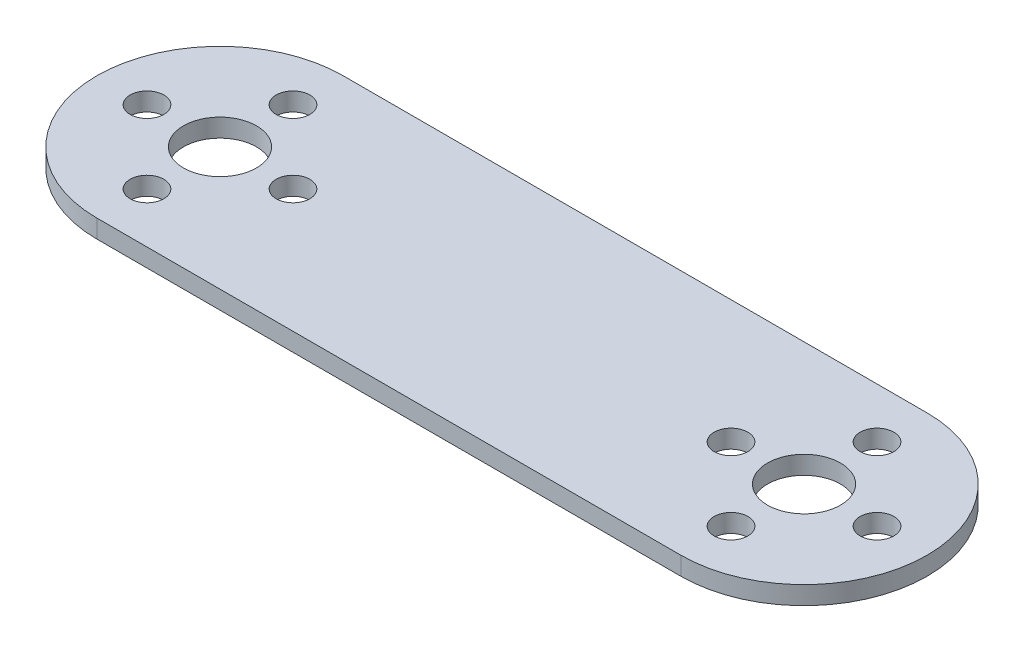
ISO-10303-21;
HEADER;
FILE_DESCRIPTION(('STEP AP214'),'2;1');
FILE_NAME('part.step','',(''),(''),'','','');
FILE_SCHEMA(('AUTOMOTIVE_DESIGN { 1 0 10303 214 1 1 1 1 }'));
ENDSEC;
DATA;
#1=APPLICATION_CONTEXT('core data for automotive mechanical design processes');
#2=APPLICATION_PROTOCOL_DEFINITION('international standard','automotive_design',2000,#1);
#3=PRODUCT_CONTEXT('',#1,'mechanical');
#4=PRODUCT('Part','Part','',(#3));
#5=PRODUCT_RELATED_PRODUCT_CATEGORY('part','',(#4));
#6=PRODUCT_DEFINITION_FORMATION('','',#4);
#7=PRODUCT_DEFINITION_CONTEXT('part definition',#1,'design');
#8=PRODUCT_DEFINITION('design','',#6,#7);
#9=PRODUCT_DEFINITION_SHAPE('','',#8);
#10=(LENGTH_UNIT() NAMED_UNIT(*) SI_UNIT(.MILLI.,.METRE.));
#11=(NAMED_UNIT(*) PLANE_ANGLE_UNIT() SI_UNIT($,.RADIAN.));
#12=(NAMED_UNIT(*) SI_UNIT($,.STERADIAN.) SOLID_ANGLE_UNIT());
#13=UNCERTAINTY_MEASURE_WITH_UNIT(LENGTH_MEASURE(1.E-05),#10,'distance_accuracy_value','');
#14=(GEOMETRIC_REPRESENTATION_CONTEXT(3) GLOBAL_UNCERTAINTY_ASSIGNED_CONTEXT((#13)) GLOBAL_UNIT_ASSIGNED_CONTEXT((#10,
#11,#12)) REPRESENTATION_CONTEXT('',''));
#15=CARTESIAN_POINT('',(0.,0.,0.));
#16=DIRECTION('',(0.,0.,1.));
#17=DIRECTION('',(1.,0.,0.));
#18=AXIS2_PLACEMENT_3D('',#15,#16,#17);
#19=CARTESIAN_POINT('',(-32.,0.,0.));
#20=DIRECTION('',(0.,-1.,0.));
#21=DIRECTION('',(0.,0.,-1.));
#22=AXIS2_PLACEMENT_3D('',#19,#20,#21);
#23=CYLINDRICAL_SURFACE('',#22,13.5);
#24=DIRECTION('',(0.,-1.,0.));
#25=VECTOR('',#24,1.);
#26=CARTESIAN_POINT('',(-32.,2.,-13.5));
#27=LINE('',#26,#25);
#28=CARTESIAN_POINT('',(-32.,0.,-13.5));
#29=VERTEX_POINT('',#28);
#30=CARTESIAN_POINT('',(-32.,2.,-13.5));
#31=VERTEX_POINT('',#30);
#32=EDGE_CURVE('E105',#29,#31,#27,.F.);
#33=ORIENTED_EDGE('',*,*,#32,.F.);
#34=CARTESIAN_POINT('',(-32.,0.,0.));
#35=DIRECTION('',(0.,-1.,0.));
#36=DIRECTION('',(0.,0.,-1.));
#37=AXIS2_PLACEMENT_3D('',#34,#35,#36);
#38=CIRCLE('',#37,13.5);
#39=CARTESIAN_POINT('',(-32.,0.,13.5));
#40=VERTEX_POINT('',#39);
#41=EDGE_CURVE('E44',#40,#29,#38,.T.);
#42=ORIENTED_EDGE('',*,*,#41,.F.);
#43=DIRECTION('',(0.,-1.,0.));
#44=VECTOR('',#43,1.);
#45=CARTESIAN_POINT('',(-32.,2.,13.5));
#46=LINE('',#45,#44);
#47=CARTESIAN_POINT('',(-32.,2.,13.5));
#48=VERTEX_POINT('',#47);
#49=EDGE_CURVE('E80',#48,#40,#46,.T.);
#50=ORIENTED_EDGE('',*,*,#49,.F.);
#51=CARTESIAN_POINT('',(-32.,2.,0.));
#52=DIRECTION('',(0.,-1.,0.));
#53=DIRECTION('',(0.,0.,-1.));
#54=AXIS2_PLACEMENT_3D('',#51,#52,#53);
#55=CIRCLE('',#54,13.5);
#56=EDGE_CURVE('E11',#31,#48,#55,.F.);
#57=ORIENTED_EDGE('',*,*,#56,.F.);
#58=EDGE_LOOP('',(#33,#42,#50,#57));
#59=FACE_BOUND('',#58,.T.);
#60=ADVANCED_FACE('F37',(#59),#23,.T.);
#61=CARTESIAN_POINT('',(32.,0.,0.));
#62=DIRECTION('',(0.,-1.,0.));
#63=DIRECTION('',(0.,0.,-1.));
#64=AXIS2_PLACEMENT_3D('',#61,#62,#63);
#65=CYLINDRICAL_SURFACE('',#64,13.5);
#66=DIRECTION('',(0.,-1.,0.));
#67=VECTOR('',#66,1.);
#68=CARTESIAN_POINT('',(32.,2.,13.5));
#69=LINE('',#68,#67);
#70=CARTESIAN_POINT('',(32.,0.,13.5));
#71=VERTEX_POINT('',#70);
#72=CARTESIAN_POINT('',(32.,2.,13.5));
#73=VERTEX_POINT('',#72);
#74=EDGE_CURVE('E79',#71,#73,#69,.F.);
#75=ORIENTED_EDGE('',*,*,#74,.F.);
#76=CARTESIAN_POINT('',(32.,0.,0.));
#77=DIRECTION('',(0.,-1.,0.));
#78=DIRECTION('',(0.,0.,-1.));
#79=AXIS2_PLACEMENT_3D('',#76,#77,#78);
#80=CIRCLE('',#79,13.5);
#81=CARTESIAN_POINT('',(32.,0.,-13.5));
#82=VERTEX_POINT('',#81);
#83=EDGE_CURVE('E86',#82,#71,#80,.T.);
#84=ORIENTED_EDGE('',*,*,#83,.F.);
#85=DIRECTION('',(0.,-1.,0.));
#86=VECTOR('',#85,1.);
#87=CARTESIAN_POINT('',(32.,2.,-13.5));
#88=LINE('',#87,#86);
#89=CARTESIAN_POINT('',(32.,2.,-13.5));
#90=VERTEX_POINT('',#89);
#91=EDGE_CURVE('E93',#90,#82,#88,.T.);
#92=ORIENTED_EDGE('',*,*,#91,.F.);
#93=CARTESIAN_POINT('',(32.,2.,0.));
#94=DIRECTION('',(0.,-1.,0.));
#95=DIRECTION('',(0.,0.,-1.));
#96=AXIS2_PLACEMENT_3D('',#93,#94,#95);
#97=CIRCLE('',#96,13.5);
#98=EDGE_CURVE('E92',#73,#90,#97,.F.);
#99=ORIENTED_EDGE('',*,*,#98,.F.);
#100=EDGE_LOOP('',(#75,#84,#92,#99));
#101=FACE_BOUND('',#100,.T.);
#102=ADVANCED_FACE('F96',(#101),#65,.T.);
#103=CARTESIAN_POINT('',(-45.5,2.,13.5));
#104=DIRECTION('',(0.,0.,-1.));
#105=DIRECTION('',(-1.,0.,0.));
#106=AXIS2_PLACEMENT_3D('',#103,#104,#105);
#107=PLANE('',#106);
#108=DIRECTION('',(1.,0.,0.));
#109=VECTOR('',#108,1.);
#110=CARTESIAN_POINT('',(-45.5,2.,13.5));
#111=LINE('',#110,#109);
#112=EDGE_CURVE('E100',#48,#73,#111,.T.);
#113=ORIENTED_EDGE('',*,*,#112,.F.);
#114=ORIENTED_EDGE('',*,*,#49,.T.);
#115=DIRECTION('',(1.,0.,0.));
#116=VECTOR('',#115,1.);
#117=CARTESIAN_POINT('',(-45.5,0.,13.5));
#118=LINE('',#117,#116);
#119=EDGE_CURVE('E74',#40,#71,#118,.T.);
#120=ORIENTED_EDGE('',*,*,#119,.T.);
#121=ORIENTED_EDGE('',*,*,#74,.T.);
#122=EDGE_LOOP('',(#113,#114,#120,#121));
#123=FACE_BOUND('',#122,.T.);
#124=ADVANCED_FACE('F77',(#123),#107,.F.);
#125=CARTESIAN_POINT('',(-45.5,2.,-13.5));
#126=DIRECTION('',(0.,0.,1.));
#127=DIRECTION('',(1.,0.,0.));
#128=AXIS2_PLACEMENT_3D('',#125,#126,#127);
#129=PLANE('',#128);
#130=DIRECTION('',(-1.,0.,0.));
#131=VECTOR('',#130,1.);
#132=CARTESIAN_POINT('',(-45.5,0.,-13.5));
#133=LINE('',#132,#131);
#134=EDGE_CURVE('E82',#82,#29,#133,.T.);
#135=ORIENTED_EDGE('',*,*,#134,.T.);
#136=ORIENTED_EDGE('',*,*,#32,.T.);
#137=DIRECTION('',(-1.,0.,0.));
#138=VECTOR('',#137,1.);
#139=CARTESIAN_POINT('',(-45.5,2.,-13.5));
#140=LINE('',#139,#138);
#141=EDGE_CURVE('E97',#90,#31,#140,.T.);
#142=ORIENTED_EDGE('',*,*,#141,.F.);
#143=ORIENTED_EDGE('',*,*,#91,.T.);
#144=EDGE_LOOP('',(#135,#136,#142,#143));
#145=FACE_BOUND('',#144,.T.);
#146=ADVANCED_FACE('F110',(#145),#129,.F.);
#147=CARTESIAN_POINT('',(-45.5,2.,-13.5));
#148=DIRECTION('',(0.,-1.,0.));
#149=DIRECTION('',(0.,0.,-1.));
#150=AXIS2_PLACEMENT_3D('',#147,#148,#149);
#151=PLANE('',#150);
#152=CARTESIAN_POINT('',(32.,2.,-8.));
#153=DIRECTION('',(0.,1.,0.));
#154=DIRECTION('',(0.,0.,1.));
#155=AXIS2_PLACEMENT_3D('',#152,#153,#154);
#156=CIRCLE('',#155,1.85);
#157=CARTESIAN_POINT('',(32.,2.,-6.15));
#158=VERTEX_POINT('',#157);
#159=EDGE_CURVE('E167',#158,#158,#156,.T.);
#160=ORIENTED_EDGE('',*,*,#159,.F.);
#161=EDGE_LOOP('',(#160));
#162=FACE_BOUND('',#161,.T.);
#163=CARTESIAN_POINT('',(32.,2.,8.));
#164=DIRECTION('',(0.,1.,0.));
#165=DIRECTION('',(0.,0.,1.));
#166=AXIS2_PLACEMENT_3D('',#163,#164,#165);
#167=CIRCLE('',#166,1.85);
#168=CARTESIAN_POINT('',(32.,2.,9.85));
#169=VERTEX_POINT('',#168);
#170=EDGE_CURVE('E161',#169,#169,#167,.T.);
#171=ORIENTED_EDGE('',*,*,#170,.F.);
#172=EDGE_LOOP('',(#171));
#173=FACE_BOUND('',#172,.T.);
#174=CARTESIAN_POINT('',(24.,2.,0.));
#175=DIRECTION('',(0.,1.,0.));
#176=DIRECTION('',(0.,0.,1.));
#177=AXIS2_PLACEMENT_3D('',#174,#175,#176);
#178=CIRCLE('',#177,1.85);
#179=CARTESIAN_POINT('',(24.,2.,1.85));
#180=VERTEX_POINT('',#179);
#181=EDGE_CURVE('E155',#180,#180,#178,.T.);
#182=ORIENTED_EDGE('',*,*,#181,.F.);
#183=EDGE_LOOP('',(#182));
#184=FACE_BOUND('',#183,.T.);
#185=CARTESIAN_POINT('',(40.,2.,0.));
#186=DIRECTION('',(0.,1.,0.));
#187=DIRECTION('',(0.,0.,1.));
#188=AXIS2_PLACEMENT_3D('',#185,#186,#187);
#189=CIRCLE('',#188,1.85);
#190=CARTESIAN_POINT('',(40.,2.,1.85));
#191=VERTEX_POINT('',#190);
#192=EDGE_CURVE('E149',#191,#191,#189,.T.);
#193=ORIENTED_EDGE('',*,*,#192,.F.);
#194=EDGE_LOOP('',(#193));
#195=FACE_BOUND('',#194,.T.);
#196=CARTESIAN_POINT('',(32.,2.,0.));
#197=DIRECTION('',(0.,1.,0.));
#198=DIRECTION('',(0.,0.,1.));
#199=AXIS2_PLACEMENT_3D('',#196,#197,#198);
#200=CIRCLE('',#199,4.);
#201=CARTESIAN_POINT('',(32.,2.,4.00000000000001));
#202=VERTEX_POINT('',#201);
#203=EDGE_CURVE('E143',#202,#202,#200,.T.);
#204=ORIENTED_EDGE('',*,*,#203,.F.);
#205=EDGE_LOOP('',(#204));
#206=FACE_BOUND('',#205,.T.);
#207=CARTESIAN_POINT('',(-32.,2.,-8.));
#208=DIRECTION('',(0.,1.,0.));
#209=DIRECTION('',(0.,0.,1.));
#210=AXIS2_PLACEMENT_3D('',#207,#208,#209);
#211=CIRCLE('',#210,1.85);
#212=CARTESIAN_POINT('',(-32.,2.,-6.15));
#213=VERTEX_POINT('',#212);
#214=EDGE_CURVE('E137',#213,#213,#211,.T.);
#215=ORIENTED_EDGE('',*,*,#214,.F.);
#216=EDGE_LOOP('',(#215));
#217=FACE_BOUND('',#216,.T.);
#218=CARTESIAN_POINT('',(-32.,2.,8.));
#219=DIRECTION('',(0.,1.,0.));
#220=DIRECTION('',(0.,0.,1.));
#221=AXIS2_PLACEMENT_3D('',#218,#219,#220);
#222=CIRCLE('',#221,1.85);
#223=CARTESIAN_POINT('',(-32.,2.,9.85));
#224=VERTEX_POINT('',#223);
#225=EDGE_CURVE('E131',#224,#224,#222,.T.);
#226=ORIENTED_EDGE('',*,*,#225,.F.);
#227=EDGE_LOOP('',(#226));
#228=FACE_BOUND('',#227,.T.);
#229=CARTESIAN_POINT('',(-40.,2.,0.));
#230=DIRECTION('',(0.,1.,0.));
#231=DIRECTION('',(0.,0.,1.));
#232=AXIS2_PLACEMENT_3D('',#229,#230,#231);
#233=CIRCLE('',#232,1.85);
#234=CARTESIAN_POINT('',(-40.,2.,1.85));
#235=VERTEX_POINT('',#234);
#236=EDGE_CURVE('E125',#235,#235,#233,.T.);
#237=ORIENTED_EDGE('',*,*,#236,.F.);
#238=EDGE_LOOP('',(#237));
#239=FACE_BOUND('',#238,.T.);
#240=CARTESIAN_POINT('',(-24.,2.,0.));
#241=DIRECTION('',(0.,1.,0.));
#242=DIRECTION('',(0.,0.,1.));
#243=AXIS2_PLACEMENT_3D('',#240,#241,#242);
#244=CIRCLE('',#243,1.85);
#245=CARTESIAN_POINT('',(-24.,2.,1.85));
#246=VERTEX_POINT('',#245);
#247=EDGE_CURVE('E119',#246,#246,#244,.T.);
#248=ORIENTED_EDGE('',*,*,#247,.F.);
#249=EDGE_LOOP('',(#248));
#250=FACE_BOUND('',#249,.T.);
#251=CARTESIAN_POINT('',(-32.,2.,0.));
#252=DIRECTION('',(0.,1.,0.));
#253=DIRECTION('',(0.,0.,1.));
#254=AXIS2_PLACEMENT_3D('',#251,#252,#253);
#255=CIRCLE('',#254,4.);
#256=CARTESIAN_POINT('',(-32.,2.,4.00000000000001));
#257=VERTEX_POINT('',#256);
#258=EDGE_CURVE('E113',#257,#257,#255,.T.);
#259=ORIENTED_EDGE('',*,*,#258,.F.);
#260=EDGE_LOOP('',(#259));
#261=FACE_BOUND('',#260,.T.);
#262=ORIENTED_EDGE('',*,*,#141,.T.);
#263=ORIENTED_EDGE('',*,*,#56,.T.);
#264=ORIENTED_EDGE('',*,*,#112,.T.);
#265=ORIENTED_EDGE('',*,*,#98,.T.);
#266=EDGE_LOOP('',(#262,#263,#264,#265));
#267=FACE_BOUND('',#266,.T.);
#268=ADVANCED_FACE('F182',(#162,#173,#184,#195,#206,#217,#228,#239,#250,#261,#267),#151,.F.);
#269=CARTESIAN_POINT('',(-45.5,0.,-13.5));
#270=DIRECTION('',(0.,-1.,0.));
#271=DIRECTION('',(0.,0.,-1.));
#272=AXIS2_PLACEMENT_3D('',#269,#270,#271);
#273=PLANE('',#272);
#274=CARTESIAN_POINT('',(32.,0.,-8.));
#275=DIRECTION('',(0.,1.,0.));
#276=DIRECTION('',(0.,0.,1.));
#277=AXIS2_PLACEMENT_3D('',#274,#275,#276);
#278=CIRCLE('',#277,1.85);
#279=CARTESIAN_POINT('',(32.,0.,-6.15));
#280=VERTEX_POINT('',#279);
#281=EDGE_CURVE('E164',#280,#280,#278,.T.);
#282=ORIENTED_EDGE('',*,*,#281,.T.);
#283=EDGE_LOOP('',(#282));
#284=FACE_BOUND('',#283,.T.);
#285=CARTESIAN_POINT('',(32.,0.,8.));
#286=DIRECTION('',(0.,1.,0.));
#287=DIRECTION('',(0.,0.,1.));
#288=AXIS2_PLACEMENT_3D('',#285,#286,#287);
#289=CIRCLE('',#288,1.85);
#290=CARTESIAN_POINT('',(32.,0.,9.85));
#291=VERTEX_POINT('',#290);
#292=EDGE_CURVE('E158',#291,#291,#289,.T.);
#293=ORIENTED_EDGE('',*,*,#292,.T.);
#294=EDGE_LOOP('',(#293));
#295=FACE_BOUND('',#294,.T.);
#296=CARTESIAN_POINT('',(24.,0.,0.));
#297=DIRECTION('',(0.,1.,0.));
#298=DIRECTION('',(0.,0.,1.));
#299=AXIS2_PLACEMENT_3D('',#296,#297,#298);
#300=CIRCLE('',#299,1.85);
#301=CARTESIAN_POINT('',(24.,0.,1.85));
#302=VERTEX_POINT('',#301);
#303=EDGE_CURVE('E152',#302,#302,#300,.T.);
#304=ORIENTED_EDGE('',*,*,#303,.T.);
#305=EDGE_LOOP('',(#304));
#306=FACE_BOUND('',#305,.T.);
#307=CARTESIAN_POINT('',(40.,0.,0.));
#308=DIRECTION('',(0.,1.,0.));
#309=DIRECTION('',(0.,0.,1.));
#310=AXIS2_PLACEMENT_3D('',#307,#308,#309);
#311=CIRCLE('',#310,1.85);
#312=CARTESIAN_POINT('',(40.,0.,1.85));
#313=VERTEX_POINT('',#312);
#314=EDGE_CURVE('E146',#313,#313,#311,.T.);
#315=ORIENTED_EDGE('',*,*,#314,.T.);
#316=EDGE_LOOP('',(#315));
#317=FACE_BOUND('',#316,.T.);
#318=CARTESIAN_POINT('',(32.,0.,0.));
#319=DIRECTION('',(0.,1.,0.));
#320=DIRECTION('',(0.,0.,1.));
#321=AXIS2_PLACEMENT_3D('',#318,#319,#320);
#322=CIRCLE('',#321,4.);
#323=CARTESIAN_POINT('',(32.,0.,4.00000000000001));
#324=VERTEX_POINT('',#323);
#325=EDGE_CURVE('E140',#324,#324,#322,.T.);
#326=ORIENTED_EDGE('',*,*,#325,.T.);
#327=EDGE_LOOP('',(#326));
#328=FACE_BOUND('',#327,.T.);
#329=CARTESIAN_POINT('',(-32.,0.,-8.));
#330=DIRECTION('',(0.,1.,0.));
#331=DIRECTION('',(0.,0.,1.));
#332=AXIS2_PLACEMENT_3D('',#329,#330,#331);
#333=CIRCLE('',#332,1.85);
#334=CARTESIAN_POINT('',(-32.,0.,-6.15));
#335=VERTEX_POINT('',#334);
#336=EDGE_CURVE('E134',#335,#335,#333,.T.);
#337=ORIENTED_EDGE('',*,*,#336,.T.);
#338=EDGE_LOOP('',(#337));
#339=FACE_BOUND('',#338,.T.);
#340=CARTESIAN_POINT('',(-32.,0.,8.));
#341=DIRECTION('',(0.,1.,0.));
#342=DIRECTION('',(0.,0.,1.));
#343=AXIS2_PLACEMENT_3D('',#340,#341,#342);
#344=CIRCLE('',#343,1.85);
#345=CARTESIAN_POINT('',(-32.,0.,9.85));
#346=VERTEX_POINT('',#345);
#347=EDGE_CURVE('E128',#346,#346,#344,.T.);
#348=ORIENTED_EDGE('',*,*,#347,.T.);
#349=EDGE_LOOP('',(#348));
#350=FACE_BOUND('',#349,.T.);
#351=CARTESIAN_POINT('',(-40.,0.,0.));
#352=DIRECTION('',(0.,1.,0.));
#353=DIRECTION('',(0.,0.,1.));
#354=AXIS2_PLACEMENT_3D('',#351,#352,#353);
#355=CIRCLE('',#354,1.85);
#356=CARTESIAN_POINT('',(-40.,0.,1.85));
#357=VERTEX_POINT('',#356);
#358=EDGE_CURVE('E122',#357,#357,#355,.T.);
#359=ORIENTED_EDGE('',*,*,#358,.T.);
#360=EDGE_LOOP('',(#359));
#361=FACE_BOUND('',#360,.T.);
#362=CARTESIAN_POINT('',(-24.,0.,0.));
#363=DIRECTION('',(0.,1.,0.));
#364=DIRECTION('',(0.,0.,1.));
#365=AXIS2_PLACEMENT_3D('',#362,#363,#364);
#366=CIRCLE('',#365,1.85);
#367=CARTESIAN_POINT('',(-24.,0.,1.85));
#368=VERTEX_POINT('',#367);
#369=EDGE_CURVE('E116',#368,#368,#366,.T.);
#370=ORIENTED_EDGE('',*,*,#369,.T.);
#371=EDGE_LOOP('',(#370));
#372=FACE_BOUND('',#371,.T.);
#373=CARTESIAN_POINT('',(-32.,0.,0.));
#374=DIRECTION('',(0.,1.,0.));
#375=DIRECTION('',(0.,0.,1.));
#376=AXIS2_PLACEMENT_3D('',#373,#374,#375);
#377=CIRCLE('',#376,4.);
#378=CARTESIAN_POINT('',(-32.,0.,4.00000000000001));
#379=VERTEX_POINT('',#378);
#380=EDGE_CURVE('E83',#379,#379,#377,.T.);
#381=ORIENTED_EDGE('',*,*,#380,.T.);
#382=EDGE_LOOP('',(#381));
#383=FACE_BOUND('',#382,.T.);
#384=ORIENTED_EDGE('',*,*,#119,.F.);
#385=ORIENTED_EDGE('',*,*,#41,.T.);
#386=ORIENTED_EDGE('',*,*,#134,.F.);
#387=ORIENTED_EDGE('',*,*,#83,.T.);
#388=EDGE_LOOP('',(#384,#385,#386,#387));
#389=FACE_BOUND('',#388,.T.);
#390=ADVANCED_FACE('F87',(#284,#295,#306,#317,#328,#339,#350,#361,#372,#383,#389),#273,.T.);
#391=CARTESIAN_POINT('',(-32.,0.,0.));
#392=DIRECTION('',(0.,1.,0.));
#393=DIRECTION('',(0.,0.,1.));
#394=AXIS2_PLACEMENT_3D('',#391,#392,#393);
#395=CYLINDRICAL_SURFACE('',#394,4.);
#396=ORIENTED_EDGE('',*,*,#380,.F.);
#397=EDGE_LOOP('',(#396));
#398=FACE_BOUND('',#397,.T.);
#399=ORIENTED_EDGE('',*,*,#258,.T.);
#400=EDGE_LOOP('',(#399));
#401=FACE_BOUND('',#400,.T.);
#402=ADVANCED_FACE('F204',(#398,#401),#395,.F.);
#403=CARTESIAN_POINT('',(-24.,0.,0.));
#404=DIRECTION('',(0.,1.,0.));
#405=DIRECTION('',(0.,0.,1.));
#406=AXIS2_PLACEMENT_3D('',#403,#404,#405);
#407=CYLINDRICAL_SURFACE('',#406,1.85);
#408=ORIENTED_EDGE('',*,*,#369,.F.);
#409=EDGE_LOOP('',(#408));
#410=FACE_BOUND('',#409,.T.);
#411=ORIENTED_EDGE('',*,*,#247,.T.);
#412=EDGE_LOOP('',(#411));
#413=FACE_BOUND('',#412,.T.);
#414=ADVANCED_FACE('F206',(#410,#413),#407,.F.);
#415=CARTESIAN_POINT('',(-40.,0.,0.));
#416=DIRECTION('',(0.,1.,0.));
#417=DIRECTION('',(0.,0.,1.));
#418=AXIS2_PLACEMENT_3D('',#415,#416,#417);
#419=CYLINDRICAL_SURFACE('',#418,1.85);
#420=ORIENTED_EDGE('',*,*,#358,.F.);
#421=EDGE_LOOP('',(#420));
#422=FACE_BOUND('',#421,.T.);
#423=ORIENTED_EDGE('',*,*,#236,.T.);
#424=EDGE_LOOP('',(#423));
#425=FACE_BOUND('',#424,.T.);
#426=ADVANCED_FACE('F213',(#422,#425),#419,.F.);
#427=CARTESIAN_POINT('',(-32.,0.,8.));
#428=DIRECTION('',(0.,1.,0.));
#429=DIRECTION('',(0.,0.,1.));
#430=AXIS2_PLACEMENT_3D('',#427,#428,#429);
#431=CYLINDRICAL_SURFACE('',#430,1.85);
#432=ORIENTED_EDGE('',*,*,#347,.F.);
#433=EDGE_LOOP('',(#432));
#434=FACE_BOUND('',#433,.T.);
#435=ORIENTED_EDGE('',*,*,#225,.T.);
#436=EDGE_LOOP('',(#435));
#437=FACE_BOUND('',#436,.T.);
#438=ADVANCED_FACE('F261',(#434,#437),#431,.F.);
#439=CARTESIAN_POINT('',(-32.,0.,-8.));
#440=DIRECTION('',(0.,1.,0.));
#441=DIRECTION('',(0.,0.,1.));
#442=AXIS2_PLACEMENT_3D('',#439,#440,#441);
#443=CYLINDRICAL_SURFACE('',#442,1.85);
#444=ORIENTED_EDGE('',*,*,#336,.F.);
#445=EDGE_LOOP('',(#444));
#446=FACE_BOUND('',#445,.T.);
#447=ORIENTED_EDGE('',*,*,#214,.T.);
#448=EDGE_LOOP('',(#447));
#449=FACE_BOUND('',#448,.T.);
#450=ADVANCED_FACE('F271',(#446,#449),#443,.F.);
#451=CARTESIAN_POINT('',(32.,0.,0.));
#452=DIRECTION('',(0.,1.,0.));
#453=DIRECTION('',(0.,0.,1.));
#454=AXIS2_PLACEMENT_3D('',#451,#452,#453);
#455=CYLINDRICAL_SURFACE('',#454,4.);
#456=ORIENTED_EDGE('',*,*,#325,.F.);
#457=EDGE_LOOP('',(#456));
#458=FACE_BOUND('',#457,.T.);
#459=ORIENTED_EDGE('',*,*,#203,.T.);
#460=EDGE_LOOP('',(#459));
#461=FACE_BOUND('',#460,.T.);
#462=ADVANCED_FACE('F281',(#458,#461),#455,.F.);
#463=CARTESIAN_POINT('',(40.,0.,0.));
#464=DIRECTION('',(0.,1.,0.));
#465=DIRECTION('',(0.,0.,1.));
#466=AXIS2_PLACEMENT_3D('',#463,#464,#465);
#467=CYLINDRICAL_SURFACE('',#466,1.85);
#468=ORIENTED_EDGE('',*,*,#314,.F.);
#469=EDGE_LOOP('',(#468));
#470=FACE_BOUND('',#469,.T.);
#471=ORIENTED_EDGE('',*,*,#192,.T.);
#472=EDGE_LOOP('',(#471));
#473=FACE_BOUND('',#472,.T.);
#474=ADVANCED_FACE('F291',(#470,#473),#467,.F.);
#475=CARTESIAN_POINT('',(24.,0.,0.));
#476=DIRECTION('',(0.,1.,0.));
#477=DIRECTION('',(0.,0.,1.));
#478=AXIS2_PLACEMENT_3D('',#475,#476,#477);
#479=CYLINDRICAL_SURFACE('',#478,1.85);
#480=ORIENTED_EDGE('',*,*,#303,.F.);
#481=EDGE_LOOP('',(#480));
#482=FACE_BOUND('',#481,.T.);
#483=ORIENTED_EDGE('',*,*,#181,.T.);
#484=EDGE_LOOP('',(#483));
#485=FACE_BOUND('',#484,.T.);
#486=ADVANCED_FACE('F301',(#482,#485),#479,.F.);
#487=CARTESIAN_POINT('',(32.,0.,8.));
#488=DIRECTION('',(0.,1.,0.));
#489=DIRECTION('',(0.,0.,1.));
#490=AXIS2_PLACEMENT_3D('',#487,#488,#489);
#491=CYLINDRICAL_SURFACE('',#490,1.85);
#492=ORIENTED_EDGE('',*,*,#292,.F.);
#493=EDGE_LOOP('',(#492));
#494=FACE_BOUND('',#493,.T.);
#495=ORIENTED_EDGE('',*,*,#170,.T.);
#496=EDGE_LOOP('',(#495));
#497=FACE_BOUND('',#496,.T.);
#498=ADVANCED_FACE('F178',(#494,#497),#491,.F.);
#499=CARTESIAN_POINT('',(32.,0.,-8.));
#500=DIRECTION('',(0.,1.,0.));
#501=DIRECTION('',(0.,0.,1.));
#502=AXIS2_PLACEMENT_3D('',#499,#500,#501);
#503=CYLINDRICAL_SURFACE('',#502,1.85);
#504=ORIENTED_EDGE('',*,*,#281,.F.);
#505=EDGE_LOOP('',(#504));
#506=FACE_BOUND('',#505,.T.);
#507=ORIENTED_EDGE('',*,*,#159,.T.);
#508=EDGE_LOOP('',(#507));
#509=FACE_BOUND('',#508,.T.);
#510=ADVANCED_FACE('F175',(#506,#509),#503,.F.);
#511=CLOSED_SHELL('',(#60,#102,#124,#146,#268,#390,#402,#414,#426,#438,#450,#462,#474,#486,#498,#510));
#512=MANIFOLD_SOLID_BREP('B2',#511);
#513=ADVANCED_BREP_SHAPE_REPRESENTATION('',(#18,#512),#14);
#514=SHAPE_DEFINITION_REPRESENTATION(#9,#513);
ENDSEC;
END-ISO-10303-21;
